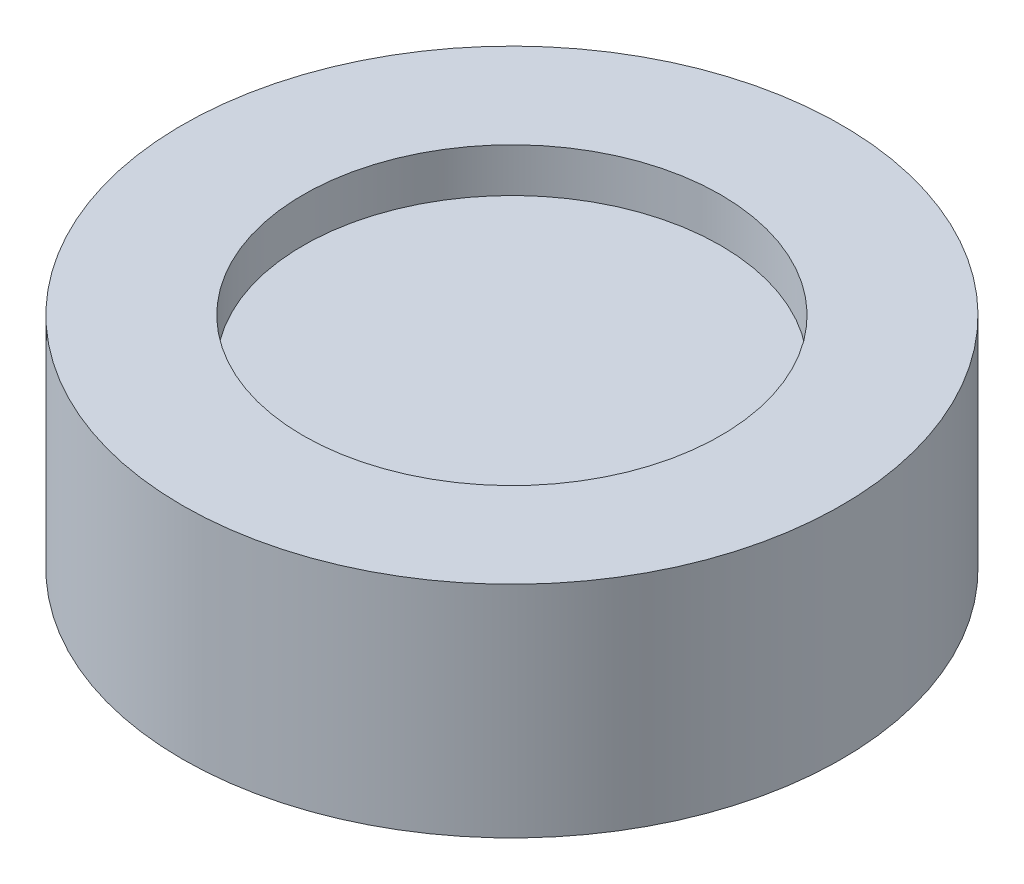
ISO-10303-21;
HEADER;
FILE_DESCRIPTION(('STEP AP214'),'2;1');
FILE_NAME('part.step','',(''),(''),'','','');
FILE_SCHEMA(('AUTOMOTIVE_DESIGN { 1 0 10303 214 1 1 1 1 }'));
ENDSEC;
DATA;
#1=APPLICATION_CONTEXT('core data for automotive mechanical design processes');
#2=APPLICATION_PROTOCOL_DEFINITION('international standard','automotive_design',2000,#1);
#3=PRODUCT_CONTEXT('',#1,'mechanical');
#4=PRODUCT('Part','Part','',(#3));
#5=PRODUCT_RELATED_PRODUCT_CATEGORY('part','',(#4));
#6=PRODUCT_DEFINITION_FORMATION('','',#4);
#7=PRODUCT_DEFINITION_CONTEXT('part definition',#1,'design');
#8=PRODUCT_DEFINITION('design','',#6,#7);
#9=PRODUCT_DEFINITION_SHAPE('','',#8);
#10=(LENGTH_UNIT() NAMED_UNIT(*) SI_UNIT(.MILLI.,.METRE.));
#11=(NAMED_UNIT(*) PLANE_ANGLE_UNIT() SI_UNIT($,.RADIAN.));
#12=(NAMED_UNIT(*) SI_UNIT($,.STERADIAN.) SOLID_ANGLE_UNIT());
#13=UNCERTAINTY_MEASURE_WITH_UNIT(LENGTH_MEASURE(1.E-05),#10,'distance_accuracy_value','');
#14=(GEOMETRIC_REPRESENTATION_CONTEXT(3) GLOBAL_UNCERTAINTY_ASSIGNED_CONTEXT((#13)) GLOBAL_UNIT_ASSIGNED_CONTEXT((#10,
#11,#12)) REPRESENTATION_CONTEXT('',''));
#15=CARTESIAN_POINT('',(0.,0.,0.));
#16=DIRECTION('',(0.,0.,1.));
#17=DIRECTION('',(1.,0.,0.));
#18=AXIS2_PLACEMENT_3D('',#15,#16,#17);
#19=CARTESIAN_POINT('',(0.,12.7,0.));
#20=DIRECTION('',(0.,-1.,0.));
#21=DIRECTION('',(0.,0.,-1.));
#22=AXIS2_PLACEMENT_3D('',#19,#20,#21);
#23=CYLINDRICAL_SURFACE('',#22,38.1);
#24=CARTESIAN_POINT('',(0.,12.7,0.));
#25=DIRECTION('',(0.,1.,0.));
#26=DIRECTION('',(0.,0.,1.));
#27=AXIS2_PLACEMENT_3D('',#24,#25,#26);
#28=CIRCLE('',#27,38.1);
#29=CARTESIAN_POINT('',(0.,12.7,38.1));
#30=VERTEX_POINT('',#29);
#31=EDGE_CURVE('E10',#30,#30,#28,.T.);
#32=ORIENTED_EDGE('',*,*,#31,.F.);
#33=EDGE_LOOP('',(#32));
#34=FACE_BOUND('',#33,.T.);
#35=CARTESIAN_POINT('',(0.,-12.7,0.));
#36=DIRECTION('',(0.,1.,0.));
#37=DIRECTION('',(0.,0.,1.));
#38=AXIS2_PLACEMENT_3D('',#35,#36,#37);
#39=CIRCLE('',#38,38.1);
#40=CARTESIAN_POINT('',(0.,-12.7,38.1));
#41=VERTEX_POINT('',#40);
#42=EDGE_CURVE('E50',#41,#41,#39,.T.);
#43=ORIENTED_EDGE('',*,*,#42,.T.);
#44=EDGE_LOOP('',(#43));
#45=FACE_BOUND('',#44,.T.);
#46=ADVANCED_FACE('F35',(#34,#45),#23,.T.);
#47=CARTESIAN_POINT('',(0.,12.7,0.));
#48=DIRECTION('',(0.,1.,0.));
#49=DIRECTION('',(0.,0.,1.));
#50=AXIS2_PLACEMENT_3D('',#47,#48,#49);
#51=PLANE('',#50);
#52=CARTESIAN_POINT('',(0.,12.7,0.));
#53=DIRECTION('',(0.,1.,0.));
#54=DIRECTION('',(0.,0.,1.));
#55=AXIS2_PLACEMENT_3D('',#52,#53,#54);
#56=CIRCLE('',#55,24.13);
#57=CARTESIAN_POINT('',(0.,12.7,24.13));
#58=VERTEX_POINT('',#57);
#59=EDGE_CURVE('E45',#58,#58,#56,.T.);
#60=ORIENTED_EDGE('',*,*,#59,.F.);
#61=EDGE_LOOP('',(#60));
#62=FACE_BOUND('',#61,.T.);
#63=ORIENTED_EDGE('',*,*,#31,.T.);
#64=EDGE_LOOP('',(#63));
#65=FACE_BOUND('',#64,.T.);
#66=ADVANCED_FACE('F73',(#62,#65),#51,.T.);
#67=CARTESIAN_POINT('',(0.,7.62,0.));
#68=DIRECTION('',(0.,1.,0.));
#69=DIRECTION('',(0.,0.,1.));
#70=AXIS2_PLACEMENT_3D('',#67,#68,#69);
#71=CYLINDRICAL_SURFACE('',#70,24.13);
#72=CARTESIAN_POINT('',(0.,7.62,0.));
#73=DIRECTION('',(0.,1.,0.));
#74=DIRECTION('',(0.,0.,1.));
#75=AXIS2_PLACEMENT_3D('',#72,#73,#74);
#76=CIRCLE('',#75,24.13);
#77=CARTESIAN_POINT('',(0.,7.62,24.13));
#78=VERTEX_POINT('',#77);
#79=EDGE_CURVE('E41',#78,#78,#76,.T.);
#80=ORIENTED_EDGE('',*,*,#79,.F.);
#81=EDGE_LOOP('',(#80));
#82=FACE_BOUND('',#81,.T.);
#83=ORIENTED_EDGE('',*,*,#59,.T.);
#84=EDGE_LOOP('',(#83));
#85=FACE_BOUND('',#84,.T.);
#86=ADVANCED_FACE('F78',(#82,#85),#71,.F.);
#87=CARTESIAN_POINT('',(0.,7.62,0.));
#88=DIRECTION('',(0.,1.,0.));
#89=DIRECTION('',(0.,0.,1.));
#90=AXIS2_PLACEMENT_3D('',#87,#88,#89);
#91=PLANE('',#90);
#92=ORIENTED_EDGE('',*,*,#79,.T.);
#93=EDGE_LOOP('',(#92));
#94=FACE_BOUND('',#93,.T.);
#95=ADVANCED_FACE('F84',(#94),#91,.T.);
#96=CARTESIAN_POINT('',(0.,-12.7,0.));
#97=DIRECTION('',(0.,-1.,0.));
#98=DIRECTION('',(0.,0.,1.));
#99=AXIS2_PLACEMENT_3D('',#96,#97,#98);
#100=PLANE('',#99);
#101=CARTESIAN_POINT('',(0.,-12.7,0.));
#102=DIRECTION('',(0.,1.,0.));
#103=DIRECTION('',(0.,0.,1.));
#104=AXIS2_PLACEMENT_3D('',#101,#102,#103);
#105=CIRCLE('',#104,24.13);
#106=CARTESIAN_POINT('',(0.,-12.7,24.13));
#107=VERTEX_POINT('',#106);
#108=EDGE_CURVE('E55',#107,#107,#105,.T.);
#109=ORIENTED_EDGE('',*,*,#108,.T.);
#110=EDGE_LOOP('',(#109));
#111=FACE_BOUND('',#110,.T.);
#112=ORIENTED_EDGE('',*,*,#42,.F.);
#113=EDGE_LOOP('',(#112));
#114=FACE_BOUND('',#113,.T.);
#115=ADVANCED_FACE('F70',(#111,#114),#100,.T.);
#116=CARTESIAN_POINT('',(0.,-7.62,0.));
#117=DIRECTION('',(0.,-1.,0.));
#118=DIRECTION('',(0.,0.,-1.));
#119=AXIS2_PLACEMENT_3D('',#116,#117,#118);
#120=CYLINDRICAL_SURFACE('',#119,24.13);
#121=CARTESIAN_POINT('',(0.,-7.62,0.));
#122=DIRECTION('',(0.,1.,0.));
#123=DIRECTION('',(0.,0.,1.));
#124=AXIS2_PLACEMENT_3D('',#121,#122,#123);
#125=CIRCLE('',#124,24.13);
#126=CARTESIAN_POINT('',(0.,-7.62,24.13));
#127=VERTEX_POINT('',#126);
#128=EDGE_CURVE('E54',#127,#127,#125,.T.);
#129=ORIENTED_EDGE('',*,*,#128,.T.);
#130=EDGE_LOOP('',(#129));
#131=FACE_BOUND('',#130,.T.);
#132=ORIENTED_EDGE('',*,*,#108,.F.);
#133=EDGE_LOOP('',(#132));
#134=FACE_BOUND('',#133,.T.);
#135=ADVANCED_FACE('F61',(#131,#134),#120,.F.);
#136=CARTESIAN_POINT('',(0.,-7.62,0.));
#137=DIRECTION('',(0.,-1.,0.));
#138=DIRECTION('',(0.,0.,1.));
#139=AXIS2_PLACEMENT_3D('',#136,#137,#138);
#140=PLANE('',#139);
#141=ORIENTED_EDGE('',*,*,#128,.F.);
#142=EDGE_LOOP('',(#141));
#143=FACE_BOUND('',#142,.T.);
#144=ADVANCED_FACE('F64',(#143),#140,.T.);
#145=CLOSED_SHELL('',(#46,#66,#86,#95,#115,#135,#144));
#146=MANIFOLD_SOLID_BREP('B2',#145);
#147=ADVANCED_BREP_SHAPE_REPRESENTATION('',(#18,#146),#14);
#148=SHAPE_DEFINITION_REPRESENTATION(#9,#147);
ENDSEC;
END-ISO-10303-21;
